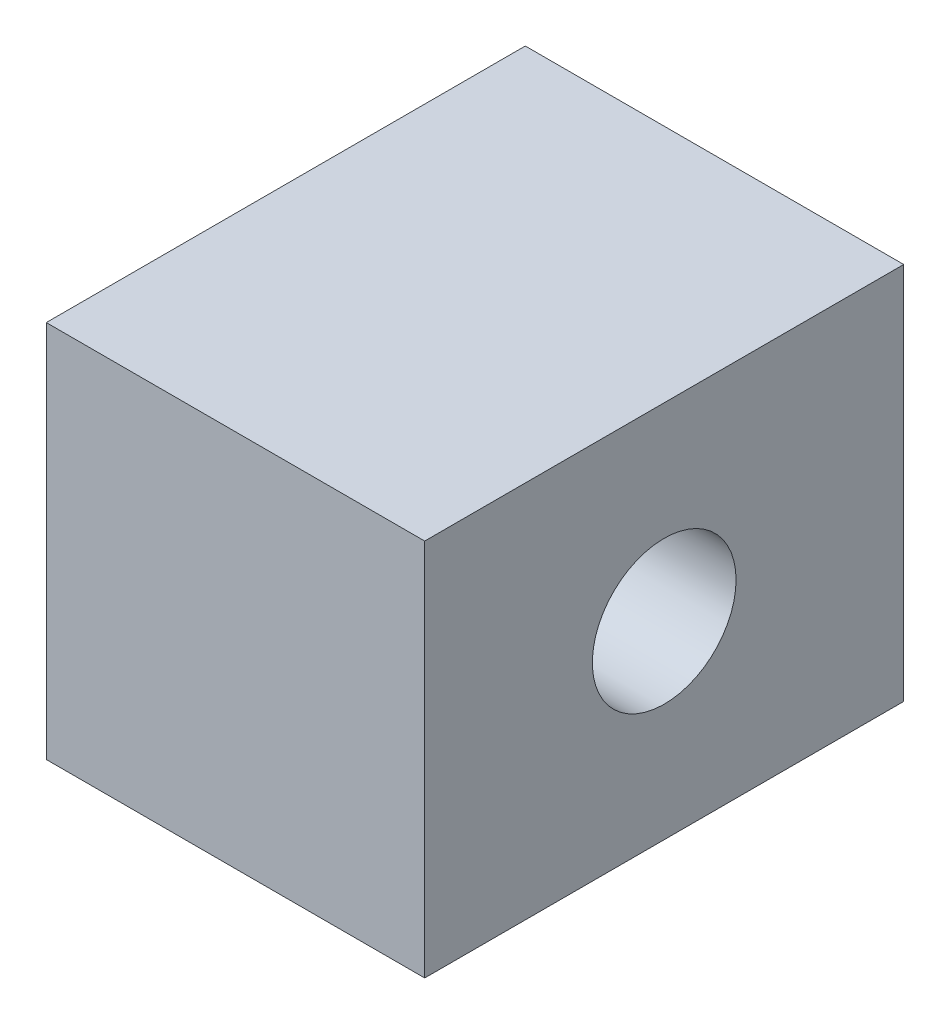
ISO-10303-21;
HEADER;
FILE_DESCRIPTION(('STEP AP214'),'2;1');
FILE_NAME('part.step','',(''),(''),'','','');
FILE_SCHEMA(('AUTOMOTIVE_DESIGN { 1 0 10303 214 1 1 1 1 }'));
ENDSEC;
DATA;
#1=APPLICATION_CONTEXT('core data for automotive mechanical design processes');
#2=APPLICATION_PROTOCOL_DEFINITION('international standard','automotive_design',2000,#1);
#3=PRODUCT_CONTEXT('',#1,'mechanical');
#4=PRODUCT('Part','Part','',(#3));
#5=PRODUCT_RELATED_PRODUCT_CATEGORY('part','',(#4));
#6=PRODUCT_DEFINITION_FORMATION('','',#4);
#7=PRODUCT_DEFINITION_CONTEXT('part definition',#1,'design');
#8=PRODUCT_DEFINITION('design','',#6,#7);
#9=PRODUCT_DEFINITION_SHAPE('','',#8);
#10=(LENGTH_UNIT() NAMED_UNIT(*) SI_UNIT(.MILLI.,.METRE.));
#11=(NAMED_UNIT(*) PLANE_ANGLE_UNIT() SI_UNIT($,.RADIAN.));
#12=(NAMED_UNIT(*) SI_UNIT($,.STERADIAN.) SOLID_ANGLE_UNIT());
#13=UNCERTAINTY_MEASURE_WITH_UNIT(LENGTH_MEASURE(1.E-05),#10,'distance_accuracy_value','');
#14=(GEOMETRIC_REPRESENTATION_CONTEXT(3) GLOBAL_UNCERTAINTY_ASSIGNED_CONTEXT((#13)) GLOBAL_UNIT_ASSIGNED_CONTEXT((#10,
#11,#12)) REPRESENTATION_CONTEXT('',''));
#15=CARTESIAN_POINT('',(0.,0.,0.));
#16=DIRECTION('',(0.,0.,1.));
#17=DIRECTION('',(1.,0.,0.));
#18=AXIS2_PLACEMENT_3D('',#15,#16,#17);
#19=CARTESIAN_POINT('',(0.,0.,20.));
#20=DIRECTION('',(1.,0.,0.));
#21=DIRECTION('',(0.,0.,-1.));
#22=AXIS2_PLACEMENT_3D('',#19,#20,#21);
#23=PLANE('',#22);
#24=CARTESIAN_POINT('',(0.,7.9,10.));
#25=DIRECTION('',(1.,0.,0.));
#26=DIRECTION('',(0.,0.,-1.));
#27=AXIS2_PLACEMENT_3D('',#24,#25,#26);
#28=CIRCLE('',#27,3.);
#29=CARTESIAN_POINT('',(0.,7.9,7.));
#30=VERTEX_POINT('',#29);
#31=EDGE_CURVE('E117',#30,#30,#28,.T.);
#32=ORIENTED_EDGE('',*,*,#31,.T.);
#33=EDGE_LOOP('',(#32));
#34=FACE_BOUND('',#33,.T.);
#35=DIRECTION('',(0.,-1.,0.));
#36=VECTOR('',#35,1.);
#37=CARTESIAN_POINT('',(0.,0.,0.));
#38=LINE('',#37,#36);
#39=CARTESIAN_POINT('',(0.,15.8,0.));
#40=VERTEX_POINT('',#39);
#41=CARTESIAN_POINT('',(0.,0.,0.));
#42=VERTEX_POINT('',#41);
#43=EDGE_CURVE('E113',#40,#42,#38,.T.);
#44=ORIENTED_EDGE('',*,*,#43,.T.);
#45=DIRECTION('',(0.,0.,-1.));
#46=VECTOR('',#45,1.);
#47=CARTESIAN_POINT('',(0.,0.,20.));
#48=LINE('',#47,#46);
#49=CARTESIAN_POINT('',(0.,0.,20.));
#50=VERTEX_POINT('',#49);
#51=EDGE_CURVE('E11',#50,#42,#48,.T.);
#52=ORIENTED_EDGE('',*,*,#51,.F.);
#53=DIRECTION('',(0.,-1.,0.));
#54=VECTOR('',#53,1.);
#55=CARTESIAN_POINT('',(0.,0.,20.));
#56=LINE('',#55,#54);
#57=CARTESIAN_POINT('',(0.,15.8,20.));
#58=VERTEX_POINT('',#57);
#59=EDGE_CURVE('E97',#58,#50,#56,.T.);
#60=ORIENTED_EDGE('',*,*,#59,.F.);
#61=DIRECTION('',(0.,0.,-1.));
#62=VECTOR('',#61,1.);
#63=CARTESIAN_POINT('',(0.,15.8,20.));
#64=LINE('',#63,#62);
#65=EDGE_CURVE('E109',#58,#40,#64,.T.);
#66=ORIENTED_EDGE('',*,*,#65,.T.);
#67=EDGE_LOOP('',(#44,#52,#60,#66));
#68=FACE_BOUND('',#67,.T.);
#69=ADVANCED_FACE('F45',(#34,#68),#23,.F.);
#70=CARTESIAN_POINT('',(0.,0.,20.));
#71=DIRECTION('',(0.,1.,0.));
#72=DIRECTION('',(0.,0.,1.));
#73=AXIS2_PLACEMENT_3D('',#70,#71,#72);
#74=PLANE('',#73);
#75=DIRECTION('',(1.,0.,0.));
#76=VECTOR('',#75,1.);
#77=CARTESIAN_POINT('',(0.,0.,0.));
#78=LINE('',#77,#76);
#79=CARTESIAN_POINT('',(15.8,0.,0.));
#80=VERTEX_POINT('',#79);
#81=EDGE_CURVE('E102',#42,#80,#78,.T.);
#82=ORIENTED_EDGE('',*,*,#81,.T.);
#83=DIRECTION('',(0.,0.,-1.));
#84=VECTOR('',#83,1.);
#85=CARTESIAN_POINT('',(15.8,0.,20.));
#86=LINE('',#85,#84);
#87=CARTESIAN_POINT('',(15.8,0.,20.));
#88=VERTEX_POINT('',#87);
#89=EDGE_CURVE('E54',#88,#80,#86,.T.);
#90=ORIENTED_EDGE('',*,*,#89,.F.);
#91=DIRECTION('',(1.,0.,0.));
#92=VECTOR('',#91,1.);
#93=CARTESIAN_POINT('',(0.,0.,20.));
#94=LINE('',#93,#92);
#95=EDGE_CURVE('E92',#50,#88,#94,.T.);
#96=ORIENTED_EDGE('',*,*,#95,.F.);
#97=ORIENTED_EDGE('',*,*,#51,.T.);
#98=EDGE_LOOP('',(#82,#90,#96,#97));
#99=FACE_BOUND('',#98,.T.);
#100=ADVANCED_FACE('F101',(#99),#74,.F.);
#101=CARTESIAN_POINT('',(15.8,0.,20.));
#102=DIRECTION('',(-1.,0.,0.));
#103=DIRECTION('',(0.,0.,1.));
#104=AXIS2_PLACEMENT_3D('',#101,#102,#103);
#105=PLANE('',#104);
#106=CARTESIAN_POINT('',(15.8,7.9,10.));
#107=DIRECTION('',(1.,0.,0.));
#108=DIRECTION('',(0.,0.,-1.));
#109=AXIS2_PLACEMENT_3D('',#106,#107,#108);
#110=CIRCLE('',#109,3.);
#111=CARTESIAN_POINT('',(15.8,7.9,7.));
#112=VERTEX_POINT('',#111);
#113=EDGE_CURVE('E137',#112,#112,#110,.T.);
#114=ORIENTED_EDGE('',*,*,#113,.F.);
#115=EDGE_LOOP('',(#114));
#116=FACE_BOUND('',#115,.T.);
#117=DIRECTION('',(0.,1.,0.));
#118=VECTOR('',#117,1.);
#119=CARTESIAN_POINT('',(15.8,0.,0.));
#120=LINE('',#119,#118);
#121=CARTESIAN_POINT('',(15.8,15.8,0.));
#122=VERTEX_POINT('',#121);
#123=EDGE_CURVE('E79',#80,#122,#120,.T.);
#124=ORIENTED_EDGE('',*,*,#123,.T.);
#125=DIRECTION('',(0.,0.,-1.));
#126=VECTOR('',#125,1.);
#127=CARTESIAN_POINT('',(15.8,15.8,20.));
#128=LINE('',#127,#126);
#129=CARTESIAN_POINT('',(15.8,15.8,20.));
#130=VERTEX_POINT('',#129);
#131=EDGE_CURVE('E104',#130,#122,#128,.T.);
#132=ORIENTED_EDGE('',*,*,#131,.F.);
#133=DIRECTION('',(0.,1.,0.));
#134=VECTOR('',#133,1.);
#135=CARTESIAN_POINT('',(15.8,0.,20.));
#136=LINE('',#135,#134);
#137=EDGE_CURVE('E95',#88,#130,#136,.T.);
#138=ORIENTED_EDGE('',*,*,#137,.F.);
#139=ORIENTED_EDGE('',*,*,#89,.T.);
#140=EDGE_LOOP('',(#124,#132,#138,#139));
#141=FACE_BOUND('',#140,.T.);
#142=ADVANCED_FACE('F105',(#116,#141),#105,.F.);
#143=CARTESIAN_POINT('',(0.,15.8,20.));
#144=DIRECTION('',(0.,-1.,0.));
#145=DIRECTION('',(0.,0.,-1.));
#146=AXIS2_PLACEMENT_3D('',#143,#144,#145);
#147=PLANE('',#146);
#148=DIRECTION('',(-1.,0.,0.));
#149=VECTOR('',#148,1.);
#150=CARTESIAN_POINT('',(0.,15.8,0.));
#151=LINE('',#150,#149);
#152=EDGE_CURVE('E85',#122,#40,#151,.T.);
#153=ORIENTED_EDGE('',*,*,#152,.T.);
#154=ORIENTED_EDGE('',*,*,#65,.F.);
#155=DIRECTION('',(-1.,0.,0.));
#156=VECTOR('',#155,1.);
#157=CARTESIAN_POINT('',(0.,15.8,20.));
#158=LINE('',#157,#156);
#159=EDGE_CURVE('E62',#130,#58,#158,.T.);
#160=ORIENTED_EDGE('',*,*,#159,.F.);
#161=ORIENTED_EDGE('',*,*,#131,.T.);
#162=EDGE_LOOP('',(#153,#154,#160,#161));
#163=FACE_BOUND('',#162,.T.);
#164=ADVANCED_FACE('F127',(#163),#147,.F.);
#165=CARTESIAN_POINT('',(0.,0.,20.));
#166=DIRECTION('',(0.,0.,-1.));
#167=DIRECTION('',(-1.,0.,0.));
#168=AXIS2_PLACEMENT_3D('',#165,#166,#167);
#169=PLANE('',#168);
#170=ORIENTED_EDGE('',*,*,#59,.T.);
#171=ORIENTED_EDGE('',*,*,#95,.T.);
#172=ORIENTED_EDGE('',*,*,#137,.T.);
#173=ORIENTED_EDGE('',*,*,#159,.T.);
#174=EDGE_LOOP('',(#170,#171,#172,#173));
#175=FACE_BOUND('',#174,.T.);
#176=ADVANCED_FACE('F93',(#175),#169,.F.);
#177=CARTESIAN_POINT('',(0.,0.,0.));
#178=DIRECTION('',(0.,0.,-1.));
#179=DIRECTION('',(-1.,0.,0.));
#180=AXIS2_PLACEMENT_3D('',#177,#178,#179);
#181=PLANE('',#180);
#182=ORIENTED_EDGE('',*,*,#43,.F.);
#183=ORIENTED_EDGE('',*,*,#152,.F.);
#184=ORIENTED_EDGE('',*,*,#123,.F.);
#185=ORIENTED_EDGE('',*,*,#81,.F.);
#186=EDGE_LOOP('',(#182,#183,#184,#185));
#187=FACE_BOUND('',#186,.T.);
#188=ADVANCED_FACE('F130',(#187),#181,.T.);
#189=CARTESIAN_POINT('',(-4.2,7.9,10.));
#190=DIRECTION('',(1.,0.,0.));
#191=DIRECTION('',(0.,0.,-1.));
#192=AXIS2_PLACEMENT_3D('',#189,#190,#191);
#193=CYLINDRICAL_SURFACE('',#192,3.);
#194=ORIENTED_EDGE('',*,*,#113,.T.);
#195=EDGE_LOOP('',(#194));
#196=FACE_BOUND('',#195,.T.);
#197=ORIENTED_EDGE('',*,*,#31,.F.);
#198=EDGE_LOOP('',(#197));
#199=FACE_BOUND('',#198,.T.);
#200=ADVANCED_FACE('F142',(#196,#199),#193,.F.);
#201=CLOSED_SHELL('',(#69,#100,#142,#164,#176,#188,#200));
#202=MANIFOLD_SOLID_BREP('B2',#201);
#203=ADVANCED_BREP_SHAPE_REPRESENTATION('',(#18,#202),#14);
#204=SHAPE_DEFINITION_REPRESENTATION(#9,#203);
ENDSEC;
END-ISO-10303-21;
